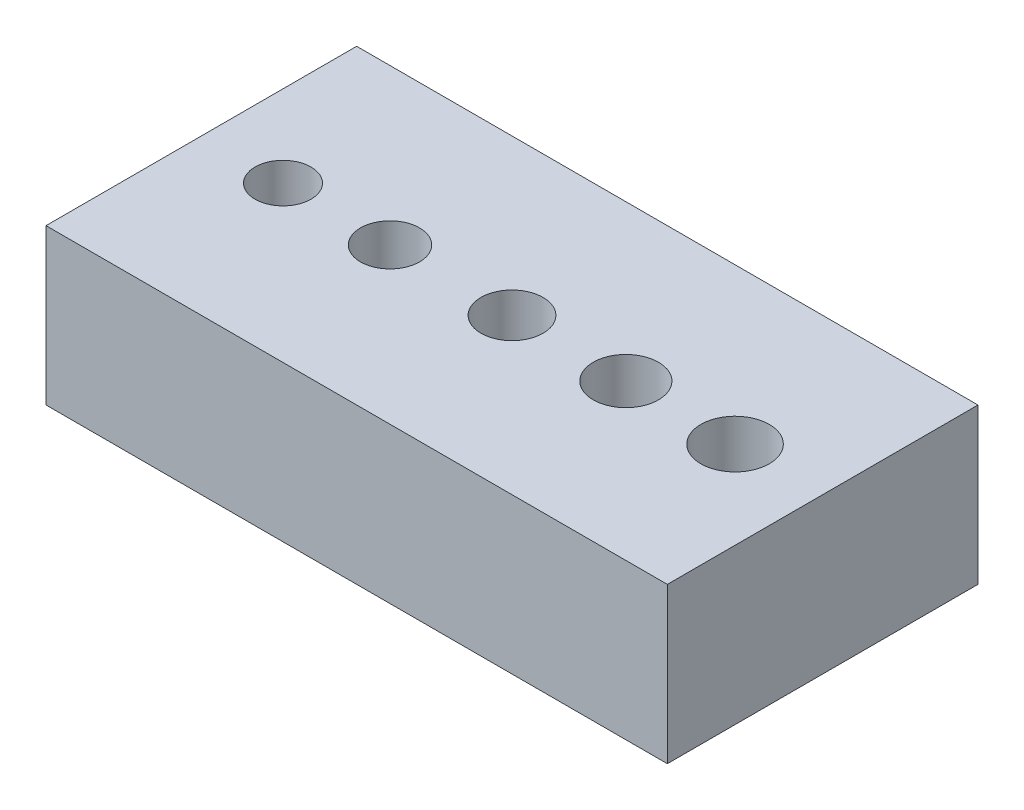
ISO-10303-21;
HEADER;
FILE_DESCRIPTION(('STEP AP214'),'2;1');
FILE_NAME('part.step','',(''),(''),'','','');
FILE_SCHEMA(('AUTOMOTIVE_DESIGN { 1 0 10303 214 1 1 1 1 }'));
ENDSEC;
DATA;
#1=APPLICATION_CONTEXT('core data for automotive mechanical design processes');
#2=APPLICATION_PROTOCOL_DEFINITION('international standard','automotive_design',2000,#1);
#3=PRODUCT_CONTEXT('',#1,'mechanical');
#4=PRODUCT('Part','Part','',(#3));
#5=PRODUCT_RELATED_PRODUCT_CATEGORY('part','',(#4));
#6=PRODUCT_DEFINITION_FORMATION('','',#4);
#7=PRODUCT_DEFINITION_CONTEXT('part definition',#1,'design');
#8=PRODUCT_DEFINITION('design','',#6,#7);
#9=PRODUCT_DEFINITION_SHAPE('','',#8);
#10=(LENGTH_UNIT() NAMED_UNIT(*) SI_UNIT(.MILLI.,.METRE.));
#11=(NAMED_UNIT(*) PLANE_ANGLE_UNIT() SI_UNIT($,.RADIAN.));
#12=(NAMED_UNIT(*) SI_UNIT($,.STERADIAN.) SOLID_ANGLE_UNIT());
#13=UNCERTAINTY_MEASURE_WITH_UNIT(LENGTH_MEASURE(1.E-05),#10,'distance_accuracy_value','');
#14=(GEOMETRIC_REPRESENTATION_CONTEXT(3) GLOBAL_UNCERTAINTY_ASSIGNED_CONTEXT((#13)) GLOBAL_UNIT_ASSIGNED_CONTEXT((#10,
#11,#12)) REPRESENTATION_CONTEXT('',''));
#15=CARTESIAN_POINT('',(0.,0.,0.));
#16=DIRECTION('',(0.,0.,1.));
#17=DIRECTION('',(1.,0.,0.));
#18=AXIS2_PLACEMENT_3D('',#15,#16,#17);
#19=CARTESIAN_POINT('',(0.,5.,0.));
#20=DIRECTION('',(0.,1.,0.));
#21=DIRECTION('',(0.,0.,1.));
#22=AXIS2_PLACEMENT_3D('',#19,#20,#21);
#23=PLANE('',#22);
#24=CARTESIAN_POINT('',(7.17986122448978,5.,0.));
#25=DIRECTION('',(0.,1.,0.));
#26=DIRECTION('',(0.,0.,1.));
#27=AXIS2_PLACEMENT_3D('',#24,#25,#26);
#28=CIRCLE('',#27,1.1);
#29=CARTESIAN_POINT('',(7.17986122448978,5.,1.1));
#30=VERTEX_POINT('',#29);
#31=EDGE_CURVE('E150',#30,#30,#28,.T.);
#32=ORIENTED_EDGE('',*,*,#31,.F.);
#33=EDGE_LOOP('',(#32));
#34=FACE_BOUND('',#33,.T.);
#35=CARTESIAN_POINT('',(-3.92689387755103,5.,0.));
#36=DIRECTION('',(0.,1.,0.));
#37=DIRECTION('',(0.,0.,1.));
#38=AXIS2_PLACEMENT_3D('',#35,#36,#37);
#39=CIRCLE('',#38,0.95);
#40=CARTESIAN_POINT('',(-3.92689387755103,5.,0.95));
#41=VERTEX_POINT('',#40);
#42=EDGE_CURVE('E134',#41,#41,#39,.T.);
#43=ORIENTED_EDGE('',*,*,#42,.F.);
#44=EDGE_LOOP('',(#43));
#45=FACE_BOUND('',#44,.T.);
#46=DIRECTION('',(0.,0.,-1.));
#47=VECTOR('',#46,1.);
#48=CARTESIAN_POINT('',(10.,5.,-5.));
#49=LINE('',#48,#47);
#50=CARTESIAN_POINT('',(10.,5.,5.));
#51=VERTEX_POINT('',#50);
#52=CARTESIAN_POINT('',(10.,5.,-5.));
#53=VERTEX_POINT('',#52);
#54=EDGE_CURVE('E92',#51,#53,#49,.T.);
#55=ORIENTED_EDGE('',*,*,#54,.T.);
#56=DIRECTION('',(-1.,0.,0.));
#57=VECTOR('',#56,1.);
#58=CARTESIAN_POINT('',(-10.,5.,-5.));
#59=LINE('',#58,#57);
#60=CARTESIAN_POINT('',(-10.,5.,-5.));
#61=VERTEX_POINT('',#60);
#62=EDGE_CURVE('E87',#53,#61,#59,.T.);
#63=ORIENTED_EDGE('',*,*,#62,.T.);
#64=DIRECTION('',(0.,0.,1.));
#65=VECTOR('',#64,1.);
#66=CARTESIAN_POINT('',(-10.,5.,-5.));
#67=LINE('',#66,#65);
#68=CARTESIAN_POINT('',(-10.,5.,5.));
#69=VERTEX_POINT('',#68);
#70=EDGE_CURVE('E90',#61,#69,#67,.T.);
#71=ORIENTED_EDGE('',*,*,#70,.T.);
#72=DIRECTION('',(1.,0.,0.));
#73=VECTOR('',#72,1.);
#74=CARTESIAN_POINT('',(-10.,5.,5.));
#75=LINE('',#74,#73);
#76=EDGE_CURVE('E57',#69,#51,#75,.T.);
#77=ORIENTED_EDGE('',*,*,#76,.T.);
#78=EDGE_LOOP('',(#55,#63,#71,#77));
#79=FACE_BOUND('',#78,.T.);
#80=CARTESIAN_POINT('',(0.,5.,0.));
#81=DIRECTION('',(0.,1.,0.));
#82=DIRECTION('',(0.,0.,1.));
#83=AXIS2_PLACEMENT_3D('',#80,#81,#82);
#84=CIRCLE('',#83,1.);
#85=CARTESIAN_POINT('',(0.,5.,0.999999999999998));
#86=VERTEX_POINT('',#85);
#87=EDGE_CURVE('E112',#86,#86,#84,.T.);
#88=ORIENTED_EDGE('',*,*,#87,.F.);
#89=EDGE_LOOP('',(#88));
#90=FACE_BOUND('',#89,.T.);
#91=CARTESIAN_POINT('',(3.66506530612244,5.,0.));
#92=DIRECTION('',(0.,1.,0.));
#93=DIRECTION('',(0.,0.,1.));
#94=AXIS2_PLACEMENT_3D('',#91,#92,#93);
#95=CIRCLE('',#94,1.05);
#96=CARTESIAN_POINT('',(3.66506530612244,5.,1.05));
#97=VERTEX_POINT('',#96);
#98=EDGE_CURVE('E142',#97,#97,#95,.T.);
#99=ORIENTED_EDGE('',*,*,#98,.F.);
#100=EDGE_LOOP('',(#99));
#101=FACE_BOUND('',#100,.T.);
#102=CARTESIAN_POINT('',(-7.37139387755102,5.,0.));
#103=DIRECTION('',(0.,1.,0.));
#104=DIRECTION('',(0.,0.,1.));
#105=AXIS2_PLACEMENT_3D('',#102,#103,#104);
#106=CIRCLE('',#105,0.899999999999999);
#107=CARTESIAN_POINT('',(-7.37139387755102,5.,0.899999999999999));
#108=VERTEX_POINT('',#107);
#109=EDGE_CURVE('E158',#108,#108,#106,.T.);
#110=ORIENTED_EDGE('',*,*,#109,.F.);
#111=EDGE_LOOP('',(#110));
#112=FACE_BOUND('',#111,.T.);
#113=ADVANCED_FACE('F39',(#34,#45,#79,#90,#101,#112),#23,.T.);
#114=CARTESIAN_POINT('',(0.,0.,0.));
#115=DIRECTION('',(0.,1.,0.));
#116=DIRECTION('',(0.,0.,1.));
#117=AXIS2_PLACEMENT_3D('',#114,#115,#116);
#118=PLANE('',#117);
#119=DIRECTION('',(0.,0.,-1.));
#120=VECTOR('',#119,1.);
#121=CARTESIAN_POINT('',(10.,0.,-5.));
#122=LINE('',#121,#120);
#123=CARTESIAN_POINT('',(10.,0.,5.));
#124=VERTEX_POINT('',#123);
#125=CARTESIAN_POINT('',(10.,0.,-5.));
#126=VERTEX_POINT('',#125);
#127=EDGE_CURVE('E108',#124,#126,#122,.T.);
#128=ORIENTED_EDGE('',*,*,#127,.F.);
#129=DIRECTION('',(1.,0.,0.));
#130=VECTOR('',#129,1.);
#131=CARTESIAN_POINT('',(-10.,0.,5.));
#132=LINE('',#131,#130);
#133=CARTESIAN_POINT('',(-10.,0.,5.));
#134=VERTEX_POINT('',#133);
#135=EDGE_CURVE('E80',#134,#124,#132,.T.);
#136=ORIENTED_EDGE('',*,*,#135,.F.);
#137=DIRECTION('',(0.,0.,1.));
#138=VECTOR('',#137,1.);
#139=CARTESIAN_POINT('',(-10.,0.,-5.));
#140=LINE('',#139,#138);
#141=CARTESIAN_POINT('',(-10.,0.,-5.));
#142=VERTEX_POINT('',#141);
#143=EDGE_CURVE('E74',#142,#134,#140,.T.);
#144=ORIENTED_EDGE('',*,*,#143,.F.);
#145=DIRECTION('',(-1.,0.,0.));
#146=VECTOR('',#145,1.);
#147=CARTESIAN_POINT('',(-10.,0.,-5.));
#148=LINE('',#147,#146);
#149=EDGE_CURVE('E97',#126,#142,#148,.T.);
#150=ORIENTED_EDGE('',*,*,#149,.F.);
#151=EDGE_LOOP('',(#128,#136,#144,#150));
#152=FACE_BOUND('',#151,.T.);
#153=CARTESIAN_POINT('',(0.,0.,0.));
#154=DIRECTION('',(0.,1.,0.));
#155=DIRECTION('',(0.,0.,1.));
#156=AXIS2_PLACEMENT_3D('',#153,#154,#155);
#157=CIRCLE('',#156,1.);
#158=CARTESIAN_POINT('',(0.,0.,0.999999999999998));
#159=VERTEX_POINT('',#158);
#160=EDGE_CURVE('E130',#159,#159,#157,.T.);
#161=ORIENTED_EDGE('',*,*,#160,.T.);
#162=EDGE_LOOP('',(#161));
#163=FACE_BOUND('',#162,.T.);
#164=CARTESIAN_POINT('',(-3.92689387755103,0.,0.));
#165=DIRECTION('',(0.,1.,0.));
#166=DIRECTION('',(0.,0.,1.));
#167=AXIS2_PLACEMENT_3D('',#164,#165,#166);
#168=CIRCLE('',#167,0.95);
#169=CARTESIAN_POINT('',(-3.92689387755103,0.,0.95));
#170=VERTEX_POINT('',#169);
#171=EDGE_CURVE('E138',#170,#170,#168,.T.);
#172=ORIENTED_EDGE('',*,*,#171,.T.);
#173=EDGE_LOOP('',(#172));
#174=FACE_BOUND('',#173,.T.);
#175=CARTESIAN_POINT('',(3.66506530612244,0.,0.));
#176=DIRECTION('',(0.,1.,0.));
#177=DIRECTION('',(0.,0.,1.));
#178=AXIS2_PLACEMENT_3D('',#175,#176,#177);
#179=CIRCLE('',#178,1.05);
#180=CARTESIAN_POINT('',(3.66506530612244,0.,1.05));
#181=VERTEX_POINT('',#180);
#182=EDGE_CURVE('E146',#181,#181,#179,.T.);
#183=ORIENTED_EDGE('',*,*,#182,.T.);
#184=EDGE_LOOP('',(#183));
#185=FACE_BOUND('',#184,.T.);
#186=CARTESIAN_POINT('',(7.17986122448978,0.,0.));
#187=DIRECTION('',(0.,1.,0.));
#188=DIRECTION('',(0.,0.,1.));
#189=AXIS2_PLACEMENT_3D('',#186,#187,#188);
#190=CIRCLE('',#189,1.1);
#191=CARTESIAN_POINT('',(7.17986122448978,0.,1.1));
#192=VERTEX_POINT('',#191);
#193=EDGE_CURVE('E154',#192,#192,#190,.T.);
#194=ORIENTED_EDGE('',*,*,#193,.T.);
#195=EDGE_LOOP('',(#194));
#196=FACE_BOUND('',#195,.T.);
#197=CARTESIAN_POINT('',(-7.37139387755102,0.,0.));
#198=DIRECTION('',(0.,1.,0.));
#199=DIRECTION('',(0.,0.,1.));
#200=AXIS2_PLACEMENT_3D('',#197,#198,#199);
#201=CIRCLE('',#200,0.899999999999999);
#202=CARTESIAN_POINT('',(-7.37139387755102,0.,0.899999999999999));
#203=VERTEX_POINT('',#202);
#204=EDGE_CURVE('E162',#203,#203,#201,.T.);
#205=ORIENTED_EDGE('',*,*,#204,.T.);
#206=EDGE_LOOP('',(#205));
#207=FACE_BOUND('',#206,.T.);
#208=ADVANCED_FACE('F125',(#152,#163,#174,#185,#196,#207),#118,.F.);
#209=CARTESIAN_POINT('',(10.,5.,-5.));
#210=DIRECTION('',(-1.,0.,0.));
#211=DIRECTION('',(0.,0.,1.));
#212=AXIS2_PLACEMENT_3D('',#209,#210,#211);
#213=PLANE('',#212);
#214=ORIENTED_EDGE('',*,*,#127,.T.);
#215=DIRECTION('',(0.,-1.,0.));
#216=VECTOR('',#215,1.);
#217=CARTESIAN_POINT('',(10.,5.,-5.));
#218=LINE('',#217,#216);
#219=EDGE_CURVE('E11',#53,#126,#218,.T.);
#220=ORIENTED_EDGE('',*,*,#219,.F.);
#221=ORIENTED_EDGE('',*,*,#54,.F.);
#222=DIRECTION('',(0.,-1.,0.));
#223=VECTOR('',#222,1.);
#224=CARTESIAN_POINT('',(10.,5.,5.));
#225=LINE('',#224,#223);
#226=EDGE_CURVE('E104',#51,#124,#225,.T.);
#227=ORIENTED_EDGE('',*,*,#226,.T.);
#228=EDGE_LOOP('',(#214,#220,#221,#227));
#229=FACE_BOUND('',#228,.T.);
#230=ADVANCED_FACE('F41',(#229),#213,.F.);
#231=CARTESIAN_POINT('',(-10.,5.,-5.));
#232=DIRECTION('',(0.,0.,1.));
#233=DIRECTION('',(1.,0.,0.));
#234=AXIS2_PLACEMENT_3D('',#231,#232,#233);
#235=PLANE('',#234);
#236=ORIENTED_EDGE('',*,*,#149,.T.);
#237=DIRECTION('',(0.,-1.,0.));
#238=VECTOR('',#237,1.);
#239=CARTESIAN_POINT('',(-10.,5.,-5.));
#240=LINE('',#239,#238);
#241=EDGE_CURVE('E49',#61,#142,#240,.T.);
#242=ORIENTED_EDGE('',*,*,#241,.F.);
#243=ORIENTED_EDGE('',*,*,#62,.F.);
#244=ORIENTED_EDGE('',*,*,#219,.T.);
#245=EDGE_LOOP('',(#236,#242,#243,#244));
#246=FACE_BOUND('',#245,.T.);
#247=ADVANCED_FACE('F96',(#246),#235,.F.);
#248=CARTESIAN_POINT('',(-10.,5.,-5.));
#249=DIRECTION('',(1.,0.,0.));
#250=DIRECTION('',(0.,0.,-1.));
#251=AXIS2_PLACEMENT_3D('',#248,#249,#250);
#252=PLANE('',#251);
#253=ORIENTED_EDGE('',*,*,#143,.T.);
#254=DIRECTION('',(0.,-1.,0.));
#255=VECTOR('',#254,1.);
#256=CARTESIAN_POINT('',(-10.,5.,5.));
#257=LINE('',#256,#255);
#258=EDGE_CURVE('E99',#69,#134,#257,.T.);
#259=ORIENTED_EDGE('',*,*,#258,.F.);
#260=ORIENTED_EDGE('',*,*,#70,.F.);
#261=ORIENTED_EDGE('',*,*,#241,.T.);
#262=EDGE_LOOP('',(#253,#259,#260,#261));
#263=FACE_BOUND('',#262,.T.);
#264=ADVANCED_FACE('F100',(#263),#252,.F.);
#265=CARTESIAN_POINT('',(-10.,5.,5.));
#266=DIRECTION('',(0.,0.,-1.));
#267=DIRECTION('',(-1.,0.,0.));
#268=AXIS2_PLACEMENT_3D('',#265,#266,#267);
#269=PLANE('',#268);
#270=ORIENTED_EDGE('',*,*,#135,.T.);
#271=ORIENTED_EDGE('',*,*,#226,.F.);
#272=ORIENTED_EDGE('',*,*,#76,.F.);
#273=ORIENTED_EDGE('',*,*,#258,.T.);
#274=EDGE_LOOP('',(#270,#271,#272,#273));
#275=FACE_BOUND('',#274,.T.);
#276=ADVANCED_FACE('F122',(#275),#269,.F.);
#277=CARTESIAN_POINT('',(0.,5.,0.));
#278=DIRECTION('',(0.,-1.,0.));
#279=DIRECTION('',(0.,0.,-1.));
#280=AXIS2_PLACEMENT_3D('',#277,#278,#279);
#281=CYLINDRICAL_SURFACE('',#280,1.);
#282=ORIENTED_EDGE('',*,*,#87,.T.);
#283=EDGE_LOOP('',(#282));
#284=FACE_BOUND('',#283,.T.);
#285=ORIENTED_EDGE('',*,*,#160,.F.);
#286=EDGE_LOOP('',(#285));
#287=FACE_BOUND('',#286,.T.);
#288=ADVANCED_FACE('F183',(#284,#287),#281,.F.);
#289=CARTESIAN_POINT('',(-3.92689387755103,5.,0.));
#290=DIRECTION('',(0.,-1.,0.));
#291=DIRECTION('',(0.,0.,-1.));
#292=AXIS2_PLACEMENT_3D('',#289,#290,#291);
#293=CYLINDRICAL_SURFACE('',#292,0.95);
#294=ORIENTED_EDGE('',*,*,#42,.T.);
#295=EDGE_LOOP('',(#294));
#296=FACE_BOUND('',#295,.T.);
#297=ORIENTED_EDGE('',*,*,#171,.F.);
#298=EDGE_LOOP('',(#297));
#299=FACE_BOUND('',#298,.T.);
#300=ADVANCED_FACE('F229',(#296,#299),#293,.F.);
#301=CARTESIAN_POINT('',(3.66506530612244,5.,0.));
#302=DIRECTION('',(0.,-1.,0.));
#303=DIRECTION('',(0.,0.,-1.));
#304=AXIS2_PLACEMENT_3D('',#301,#302,#303);
#305=CYLINDRICAL_SURFACE('',#304,1.05);
#306=ORIENTED_EDGE('',*,*,#98,.T.);
#307=EDGE_LOOP('',(#306));
#308=FACE_BOUND('',#307,.T.);
#309=ORIENTED_EDGE('',*,*,#182,.F.);
#310=EDGE_LOOP('',(#309));
#311=FACE_BOUND('',#310,.T.);
#312=ADVANCED_FACE('F237',(#308,#311),#305,.F.);
#313=CARTESIAN_POINT('',(7.17986122448978,5.,0.));
#314=DIRECTION('',(0.,-1.,0.));
#315=DIRECTION('',(0.,0.,-1.));
#316=AXIS2_PLACEMENT_3D('',#313,#314,#315);
#317=CYLINDRICAL_SURFACE('',#316,1.1);
#318=ORIENTED_EDGE('',*,*,#31,.T.);
#319=EDGE_LOOP('',(#318));
#320=FACE_BOUND('',#319,.T.);
#321=ORIENTED_EDGE('',*,*,#193,.F.);
#322=EDGE_LOOP('',(#321));
#323=FACE_BOUND('',#322,.T.);
#324=ADVANCED_FACE('F245',(#320,#323),#317,.F.);
#325=CARTESIAN_POINT('',(-7.37139387755102,5.,0.));
#326=DIRECTION('',(0.,-1.,0.));
#327=DIRECTION('',(0.,0.,-1.));
#328=AXIS2_PLACEMENT_3D('',#325,#326,#327);
#329=CYLINDRICAL_SURFACE('',#328,0.899999999999999);
#330=ORIENTED_EDGE('',*,*,#109,.T.);
#331=EDGE_LOOP('',(#330));
#332=FACE_BOUND('',#331,.T.);
#333=ORIENTED_EDGE('',*,*,#204,.F.);
#334=EDGE_LOOP('',(#333));
#335=FACE_BOUND('',#334,.T.);
#336=ADVANCED_FACE('F170',(#332,#335),#329,.F.);
#337=CLOSED_SHELL('',(#113,#208,#230,#247,#264,#276,#288,#300,#312,#324,#336));
#338=MANIFOLD_SOLID_BREP('B2',#337);
#339=ADVANCED_BREP_SHAPE_REPRESENTATION('',(#18,#338),#14);
#340=SHAPE_DEFINITION_REPRESENTATION(#9,#339);
ENDSEC;
END-ISO-10303-21;
